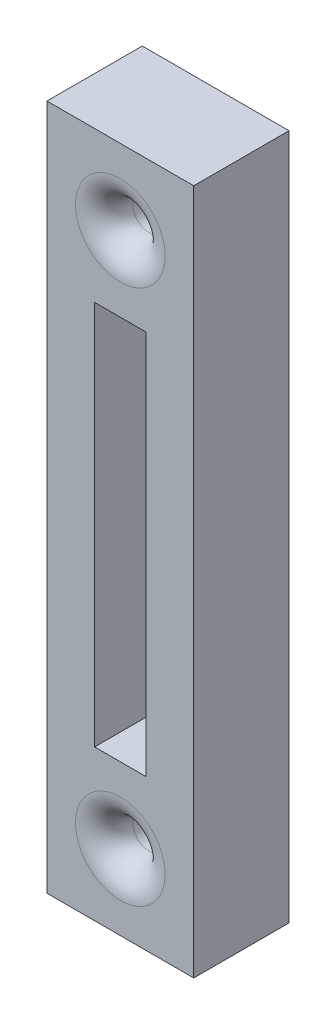
ISO-10303-21;
HEADER;
FILE_DESCRIPTION(('STEP AP214'),'2;1');
FILE_NAME('part.step','',(''),(''),'','','');
FILE_SCHEMA(('AUTOMOTIVE_DESIGN { 1 0 10303 214 1 1 1 1 }'));
ENDSEC;
DATA;
#1=APPLICATION_CONTEXT('core data for automotive mechanical design processes');
#2=APPLICATION_PROTOCOL_DEFINITION('international standard','automotive_design',2000,#1);
#3=PRODUCT_CONTEXT('',#1,'mechanical');
#4=PRODUCT('Part','Part','',(#3));
#5=PRODUCT_RELATED_PRODUCT_CATEGORY('part','',(#4));
#6=PRODUCT_DEFINITION_FORMATION('','',#4);
#7=PRODUCT_DEFINITION_CONTEXT('part definition',#1,'design');
#8=PRODUCT_DEFINITION('design','',#6,#7);
#9=PRODUCT_DEFINITION_SHAPE('','',#8);
#10=(LENGTH_UNIT() NAMED_UNIT(*) SI_UNIT(.MILLI.,.METRE.));
#11=(NAMED_UNIT(*) PLANE_ANGLE_UNIT() SI_UNIT($,.RADIAN.));
#12=(NAMED_UNIT(*) SI_UNIT($,.STERADIAN.) SOLID_ANGLE_UNIT());
#13=UNCERTAINTY_MEASURE_WITH_UNIT(LENGTH_MEASURE(1.E-05),#10,'distance_accuracy_value','');
#14=(GEOMETRIC_REPRESENTATION_CONTEXT(3) GLOBAL_UNCERTAINTY_ASSIGNED_CONTEXT((#13)) GLOBAL_UNIT_ASSIGNED_CONTEXT((#10,
#11,#12)) REPRESENTATION_CONTEXT('',''));
#15=CARTESIAN_POINT('',(0.,0.,0.));
#16=DIRECTION('',(0.,0.,1.));
#17=DIRECTION('',(1.,0.,0.));
#18=AXIS2_PLACEMENT_3D('',#15,#16,#17);
#19=CARTESIAN_POINT('',(0.,0.,10.));
#20=DIRECTION('',(0.,0.,1.));
#21=DIRECTION('',(1.,0.,0.));
#22=AXIS2_PLACEMENT_3D('',#19,#20,#21);
#23=PLANE('',#22);
#24=CARTESIAN_POINT('',(2.7,-7.9,10.));
#25=DIRECTION('',(0.,0.,1.));
#26=DIRECTION('',(1.,0.,0.));
#27=AXIS2_PLACEMENT_3D('',#24,#25,#26);
#28=CIRCLE('',#27,4.7);
#29=CARTESIAN_POINT('',(7.4,-7.9,10.));
#30=VERTEX_POINT('',#29);
#31=EDGE_CURVE('E201',#30,#30,#28,.F.);
#32=ORIENTED_EDGE('',*,*,#31,.T.);
#33=EDGE_LOOP('',(#32));
#34=FACE_BOUND('',#33,.T.);
#35=CARTESIAN_POINT('',(2.7,48.3,10.));
#36=DIRECTION('',(0.,0.,1.));
#37=DIRECTION('',(1.,0.,0.));
#38=AXIS2_PLACEMENT_3D('',#35,#36,#37);
#39=CIRCLE('',#38,4.7);
#40=CARTESIAN_POINT('',(7.4,48.3,10.));
#41=VERTEX_POINT('',#40);
#42=EDGE_CURVE('E198',#41,#41,#39,.F.);
#43=ORIENTED_EDGE('',*,*,#42,.T.);
#44=EDGE_LOOP('',(#43));
#45=FACE_BOUND('',#44,.T.);
#46=DIRECTION('',(0.,-1.,0.));
#47=VECTOR('',#46,1.);
#48=CARTESIAN_POINT('',(-5.,0.,10.));
#49=LINE('',#48,#47);
#50=CARTESIAN_POINT('',(-5.,56.2,10.));
#51=VERTEX_POINT('',#50);
#52=CARTESIAN_POINT('',(-5.,-15.8,10.));
#53=VERTEX_POINT('',#52);
#54=EDGE_CURVE('E187',#51,#53,#49,.T.);
#55=ORIENTED_EDGE('',*,*,#54,.T.);
#56=DIRECTION('',(1.,0.,0.));
#57=VECTOR('',#56,1.);
#58=CARTESIAN_POINT('',(-5.,-15.8,10.));
#59=LINE('',#58,#57);
#60=CARTESIAN_POINT('',(10.4,-15.8,10.));
#61=VERTEX_POINT('',#60);
#62=EDGE_CURVE('E145',#53,#61,#59,.T.);
#63=ORIENTED_EDGE('',*,*,#62,.T.);
#64=DIRECTION('',(0.,1.,0.));
#65=VECTOR('',#64,1.);
#66=CARTESIAN_POINT('',(10.4,0.,10.));
#67=LINE('',#66,#65);
#68=CARTESIAN_POINT('',(10.4,56.2,10.));
#69=VERTEX_POINT('',#68);
#70=EDGE_CURVE('E189',#61,#69,#67,.T.);
#71=ORIENTED_EDGE('',*,*,#70,.T.);
#72=DIRECTION('',(1.,0.,0.));
#73=VECTOR('',#72,1.);
#74=CARTESIAN_POINT('',(-5.,56.2,10.));
#75=LINE('',#74,#73);
#76=EDGE_CURVE('E155',#51,#69,#75,.T.);
#77=ORIENTED_EDGE('',*,*,#76,.F.);
#78=EDGE_LOOP('',(#55,#63,#71,#77));
#79=FACE_BOUND('',#78,.T.);
#80=DIRECTION('',(1.,0.,0.));
#81=VECTOR('',#80,1.);
#82=CARTESIAN_POINT('',(0.,0.,10.));
#83=LINE('',#82,#81);
#84=CARTESIAN_POINT('',(0.,0.,10.));
#85=VERTEX_POINT('',#84);
#86=CARTESIAN_POINT('',(5.4,0.,10.));
#87=VERTEX_POINT('',#86);
#88=EDGE_CURVE('E165',#85,#87,#83,.T.);
#89=ORIENTED_EDGE('',*,*,#88,.F.);
#90=DIRECTION('',(0.,-1.,0.));
#91=VECTOR('',#90,1.);
#92=CARTESIAN_POINT('',(0.,0.,10.));
#93=LINE('',#92,#91);
#94=CARTESIAN_POINT('',(0.,40.4,10.));
#95=VERTEX_POINT('',#94);
#96=EDGE_CURVE('E163',#95,#85,#93,.T.);
#97=ORIENTED_EDGE('',*,*,#96,.F.);
#98=DIRECTION('',(-1.,0.,0.));
#99=VECTOR('',#98,1.);
#100=CARTESIAN_POINT('',(0.,40.4,10.));
#101=LINE('',#100,#99);
#102=CARTESIAN_POINT('',(5.39999999999999,40.4,10.));
#103=VERTEX_POINT('',#102);
#104=EDGE_CURVE('E170',#103,#95,#101,.T.);
#105=ORIENTED_EDGE('',*,*,#104,.F.);
#106=DIRECTION('',(0.,1.,0.));
#107=VECTOR('',#106,1.);
#108=CARTESIAN_POINT('',(5.4,0.,10.));
#109=LINE('',#108,#107);
#110=EDGE_CURVE('E168',#87,#103,#109,.T.);
#111=ORIENTED_EDGE('',*,*,#110,.F.);
#112=EDGE_LOOP('',(#89,#97,#105,#111));
#113=FACE_BOUND('',#112,.T.);
#114=ADVANCED_FACE('F57',(#34,#45,#79,#113),#23,.T.);
#115=CARTESIAN_POINT('',(0.,0.,0.));
#116=DIRECTION('',(0.,0.,1.));
#117=DIRECTION('',(1.,0.,0.));
#118=AXIS2_PLACEMENT_3D('',#115,#116,#117);
#119=PLANE('',#118);
#120=CARTESIAN_POINT('',(2.7,-7.9,0.));
#121=DIRECTION('',(0.,0.,1.));
#122=DIRECTION('',(1.,0.,0.));
#123=AXIS2_PLACEMENT_3D('',#120,#121,#122);
#124=CIRCLE('',#123,4.7);
#125=CARTESIAN_POINT('',(7.4,-7.9,0.));
#126=VERTEX_POINT('',#125);
#127=EDGE_CURVE('E12',#126,#126,#124,.T.);
#128=ORIENTED_EDGE('',*,*,#127,.T.);
#129=EDGE_LOOP('',(#128));
#130=FACE_BOUND('',#129,.T.);
#131=CARTESIAN_POINT('',(2.7,48.3,0.));
#132=DIRECTION('',(0.,0.,1.));
#133=DIRECTION('',(1.,0.,0.));
#134=AXIS2_PLACEMENT_3D('',#131,#132,#133);
#135=CIRCLE('',#134,4.7);
#136=CARTESIAN_POINT('',(7.4,48.3,0.));
#137=VERTEX_POINT('',#136);
#138=EDGE_CURVE('E65',#137,#137,#135,.T.);
#139=ORIENTED_EDGE('',*,*,#138,.T.);
#140=EDGE_LOOP('',(#139));
#141=FACE_BOUND('',#140,.T.);
#142=DIRECTION('',(0.,-1.,0.));
#143=VECTOR('',#142,1.);
#144=CARTESIAN_POINT('',(-5.,0.,0.));
#145=LINE('',#144,#143);
#146=CARTESIAN_POINT('',(-5.,56.2,0.));
#147=VERTEX_POINT('',#146);
#148=CARTESIAN_POINT('',(-5.,-15.8,0.));
#149=VERTEX_POINT('',#148);
#150=EDGE_CURVE('E124',#147,#149,#145,.T.);
#151=ORIENTED_EDGE('',*,*,#150,.F.);
#152=DIRECTION('',(-1.,0.,0.));
#153=VECTOR('',#152,1.);
#154=CARTESIAN_POINT('',(-5.,56.2,0.));
#155=LINE('',#154,#153);
#156=CARTESIAN_POINT('',(10.4,56.2,0.));
#157=VERTEX_POINT('',#156);
#158=EDGE_CURVE('E161',#157,#147,#155,.T.);
#159=ORIENTED_EDGE('',*,*,#158,.F.);
#160=DIRECTION('',(0.,1.,0.));
#161=VECTOR('',#160,1.);
#162=CARTESIAN_POINT('',(10.4,0.,0.));
#163=LINE('',#162,#161);
#164=CARTESIAN_POINT('',(10.4,-15.8,0.));
#165=VERTEX_POINT('',#164);
#166=EDGE_CURVE('E135',#165,#157,#163,.T.);
#167=ORIENTED_EDGE('',*,*,#166,.F.);
#168=DIRECTION('',(-1.,0.,0.));
#169=VECTOR('',#168,1.);
#170=CARTESIAN_POINT('',(-5.,-15.8,0.));
#171=LINE('',#170,#169);
#172=EDGE_CURVE('E142',#165,#149,#171,.T.);
#173=ORIENTED_EDGE('',*,*,#172,.T.);
#174=EDGE_LOOP('',(#151,#159,#167,#173));
#175=FACE_BOUND('',#174,.T.);
#176=DIRECTION('',(0.,-1.,0.));
#177=VECTOR('',#176,1.);
#178=CARTESIAN_POINT('',(0.,0.,0.));
#179=LINE('',#178,#177);
#180=CARTESIAN_POINT('',(0.,40.4,0.));
#181=VERTEX_POINT('',#180);
#182=CARTESIAN_POINT('',(0.,0.,0.));
#183=VERTEX_POINT('',#182);
#184=EDGE_CURVE('E80',#181,#183,#179,.T.);
#185=ORIENTED_EDGE('',*,*,#184,.T.);
#186=DIRECTION('',(1.,0.,0.));
#187=VECTOR('',#186,1.);
#188=CARTESIAN_POINT('',(0.,0.,0.));
#189=LINE('',#188,#187);
#190=CARTESIAN_POINT('',(5.4,0.,0.));
#191=VERTEX_POINT('',#190);
#192=EDGE_CURVE('E174',#183,#191,#189,.T.);
#193=ORIENTED_EDGE('',*,*,#192,.T.);
#194=DIRECTION('',(0.,1.,0.));
#195=VECTOR('',#194,1.);
#196=CARTESIAN_POINT('',(5.4,0.,0.));
#197=LINE('',#196,#195);
#198=CARTESIAN_POINT('',(5.39999999999999,40.4,0.));
#199=VERTEX_POINT('',#198);
#200=EDGE_CURVE('E177',#191,#199,#197,.T.);
#201=ORIENTED_EDGE('',*,*,#200,.T.);
#202=DIRECTION('',(-1.,0.,0.));
#203=VECTOR('',#202,1.);
#204=CARTESIAN_POINT('',(0.,40.4,0.));
#205=LINE('',#204,#203);
#206=EDGE_CURVE('E166',#199,#181,#205,.T.);
#207=ORIENTED_EDGE('',*,*,#206,.T.);
#208=EDGE_LOOP('',(#185,#193,#201,#207));
#209=FACE_BOUND('',#208,.T.);
#210=ADVANCED_FACE('F147',(#130,#141,#175,#209),#119,.F.);
#211=CARTESIAN_POINT('',(-5.,0.,10.));
#212=DIRECTION('',(1.,0.,0.));
#213=DIRECTION('',(0.,1.,0.));
#214=AXIS2_PLACEMENT_3D('',#211,#212,#213);
#215=PLANE('',#214);
#216=ORIENTED_EDGE('',*,*,#150,.T.);
#217=DIRECTION('',(0.,0.,1.));
#218=VECTOR('',#217,1.);
#219=CARTESIAN_POINT('',(-5.,-15.8,10.));
#220=LINE('',#219,#218);
#221=EDGE_CURVE('E127',#149,#53,#220,.T.);
#222=ORIENTED_EDGE('',*,*,#221,.T.);
#223=ORIENTED_EDGE('',*,*,#54,.F.);
#224=DIRECTION('',(0.,0.,1.));
#225=VECTOR('',#224,1.);
#226=CARTESIAN_POINT('',(-5.,56.2,10.));
#227=LINE('',#226,#225);
#228=EDGE_CURVE('E130',#147,#51,#227,.T.);
#229=ORIENTED_EDGE('',*,*,#228,.F.);
#230=EDGE_LOOP('',(#216,#222,#223,#229));
#231=FACE_BOUND('',#230,.T.);
#232=ADVANCED_FACE('F126',(#231),#215,.F.);
#233=CARTESIAN_POINT('',(10.4,0.,10.));
#234=DIRECTION('',(-1.,0.,0.));
#235=DIRECTION('',(0.,-1.,0.));
#236=AXIS2_PLACEMENT_3D('',#233,#234,#235);
#237=PLANE('',#236);
#238=ORIENTED_EDGE('',*,*,#166,.T.);
#239=DIRECTION('',(0.,0.,-1.));
#240=VECTOR('',#239,1.);
#241=CARTESIAN_POINT('',(10.4,56.2,10.));
#242=LINE('',#241,#240);
#243=EDGE_CURVE('E158',#69,#157,#242,.T.);
#244=ORIENTED_EDGE('',*,*,#243,.F.);
#245=ORIENTED_EDGE('',*,*,#70,.F.);
#246=DIRECTION('',(0.,0.,-1.));
#247=VECTOR('',#246,1.);
#248=CARTESIAN_POINT('',(10.4,-15.8,10.));
#249=LINE('',#248,#247);
#250=EDGE_CURVE('E149',#61,#165,#249,.T.);
#251=ORIENTED_EDGE('',*,*,#250,.T.);
#252=EDGE_LOOP('',(#238,#244,#245,#251));
#253=FACE_BOUND('',#252,.T.);
#254=ADVANCED_FACE('F245',(#253),#237,.F.);
#255=CARTESIAN_POINT('',(0.,0.,10.));
#256=DIRECTION('',(1.,0.,0.));
#257=DIRECTION('',(0.,1.,0.));
#258=AXIS2_PLACEMENT_3D('',#255,#256,#257);
#259=PLANE('',#258);
#260=ORIENTED_EDGE('',*,*,#184,.F.);
#261=DIRECTION('',(0.,0.,-1.));
#262=VECTOR('',#261,1.);
#263=CARTESIAN_POINT('',(0.,40.4,10.));
#264=LINE('',#263,#262);
#265=EDGE_CURVE('E172',#95,#181,#264,.T.);
#266=ORIENTED_EDGE('',*,*,#265,.F.);
#267=ORIENTED_EDGE('',*,*,#96,.T.);
#268=DIRECTION('',(0.,0.,-1.));
#269=VECTOR('',#268,1.);
#270=CARTESIAN_POINT('',(0.,0.,10.));
#271=LINE('',#270,#269);
#272=EDGE_CURVE('E136',#85,#183,#271,.T.);
#273=ORIENTED_EDGE('',*,*,#272,.T.);
#274=EDGE_LOOP('',(#260,#266,#267,#273));
#275=FACE_BOUND('',#274,.T.);
#276=ADVANCED_FACE('F242',(#275),#259,.T.);
#277=CARTESIAN_POINT('',(0.,0.,10.));
#278=DIRECTION('',(0.,1.,0.));
#279=DIRECTION('',(0.,0.,1.));
#280=AXIS2_PLACEMENT_3D('',#277,#278,#279);
#281=PLANE('',#280);
#282=ORIENTED_EDGE('',*,*,#192,.F.);
#283=ORIENTED_EDGE('',*,*,#272,.F.);
#284=ORIENTED_EDGE('',*,*,#88,.T.);
#285=DIRECTION('',(0.,0.,-1.));
#286=VECTOR('',#285,1.);
#287=CARTESIAN_POINT('',(5.4,0.,10.));
#288=LINE('',#287,#286);
#289=EDGE_CURVE('E184',#87,#191,#288,.T.);
#290=ORIENTED_EDGE('',*,*,#289,.T.);
#291=EDGE_LOOP('',(#282,#283,#284,#290));
#292=FACE_BOUND('',#291,.T.);
#293=ADVANCED_FACE('F359',(#292),#281,.T.);
#294=CARTESIAN_POINT('',(5.4,0.,10.));
#295=DIRECTION('',(-1.,0.,0.));
#296=DIRECTION('',(0.,-1.,0.));
#297=AXIS2_PLACEMENT_3D('',#294,#295,#296);
#298=PLANE('',#297);
#299=ORIENTED_EDGE('',*,*,#200,.F.);
#300=ORIENTED_EDGE('',*,*,#289,.F.);
#301=ORIENTED_EDGE('',*,*,#110,.T.);
#302=DIRECTION('',(0.,0.,-1.));
#303=VECTOR('',#302,1.);
#304=CARTESIAN_POINT('',(5.39999999999999,40.4,10.));
#305=LINE('',#304,#303);
#306=EDGE_CURVE('E72',#103,#199,#305,.T.);
#307=ORIENTED_EDGE('',*,*,#306,.T.);
#308=EDGE_LOOP('',(#299,#300,#301,#307));
#309=FACE_BOUND('',#308,.T.);
#310=ADVANCED_FACE('F350',(#309),#298,.T.);
#311=CARTESIAN_POINT('',(0.,40.4,10.));
#312=DIRECTION('',(0.,-1.,0.));
#313=DIRECTION('',(0.,0.,-1.));
#314=AXIS2_PLACEMENT_3D('',#311,#312,#313);
#315=PLANE('',#314);
#316=ORIENTED_EDGE('',*,*,#206,.F.);
#317=ORIENTED_EDGE('',*,*,#306,.F.);
#318=ORIENTED_EDGE('',*,*,#104,.T.);
#319=ORIENTED_EDGE('',*,*,#265,.T.);
#320=EDGE_LOOP('',(#316,#317,#318,#319));
#321=FACE_BOUND('',#320,.T.);
#322=ADVANCED_FACE('F341',(#321),#315,.T.);
#323=CARTESIAN_POINT('',(0.,56.2,0.));
#324=DIRECTION('',(0.,-1.,0.));
#325=DIRECTION('',(0.,0.,-1.));
#326=AXIS2_PLACEMENT_3D('',#323,#324,#325);
#327=PLANE('',#326);
#328=ORIENTED_EDGE('',*,*,#228,.T.);
#329=ORIENTED_EDGE('',*,*,#76,.T.);
#330=ORIENTED_EDGE('',*,*,#243,.T.);
#331=ORIENTED_EDGE('',*,*,#158,.T.);
#332=EDGE_LOOP('',(#328,#329,#330,#331));
#333=FACE_BOUND('',#332,.T.);
#334=ADVANCED_FACE('F230',(#333),#327,.F.);
#335=CARTESIAN_POINT('',(0.,-15.8,0.));
#336=DIRECTION('',(0.,1.,0.));
#337=DIRECTION('',(0.,0.,-1.));
#338=AXIS2_PLACEMENT_3D('',#335,#336,#337);
#339=PLANE('',#338);
#340=ORIENTED_EDGE('',*,*,#221,.F.);
#341=ORIENTED_EDGE('',*,*,#172,.F.);
#342=ORIENTED_EDGE('',*,*,#250,.F.);
#343=ORIENTED_EDGE('',*,*,#62,.F.);
#344=EDGE_LOOP('',(#340,#341,#342,#343));
#345=FACE_BOUND('',#344,.T.);
#346=ADVANCED_FACE('F140',(#345),#339,.F.);
#347=CARTESIAN_POINT('',(2.7,48.3,10.));
#348=DIRECTION('',(0.,0.,-1.));
#349=DIRECTION('',(-1.,0.,0.));
#350=AXIS2_PLACEMENT_3D('',#347,#348,#349);
#351=CYLINDRICAL_SURFACE('',#350,1.7);
#352=CARTESIAN_POINT('',(2.7,48.3,7.));
#353=DIRECTION('',(0.,0.,1.));
#354=DIRECTION('',(1.,0.,0.));
#355=AXIS2_PLACEMENT_3D('',#352,#353,#354);
#356=CIRCLE('',#355,1.7);
#357=CARTESIAN_POINT('',(4.4,48.3,7.));
#358=VERTEX_POINT('',#357);
#359=EDGE_CURVE('E207',#358,#358,#356,.T.);
#360=ORIENTED_EDGE('',*,*,#359,.T.);
#361=EDGE_LOOP('',(#360));
#362=FACE_BOUND('',#361,.T.);
#363=CARTESIAN_POINT('',(2.7,48.3,3.));
#364=DIRECTION('',(0.,0.,1.));
#365=DIRECTION('',(1.,0.,0.));
#366=AXIS2_PLACEMENT_3D('',#363,#364,#365);
#367=CIRCLE('',#366,1.7);
#368=CARTESIAN_POINT('',(4.4,48.3,3.));
#369=VERTEX_POINT('',#368);
#370=EDGE_CURVE('E204',#369,#369,#367,.F.);
#371=ORIENTED_EDGE('',*,*,#370,.T.);
#372=EDGE_LOOP('',(#371));
#373=FACE_BOUND('',#372,.T.);
#374=ADVANCED_FACE('F218',(#362,#373),#351,.F.);
#375=CARTESIAN_POINT('',(2.7,-7.9,10.));
#376=DIRECTION('',(0.,0.,-1.));
#377=DIRECTION('',(-1.,0.,0.));
#378=AXIS2_PLACEMENT_3D('',#375,#376,#377);
#379=CYLINDRICAL_SURFACE('',#378,1.7);
#380=CARTESIAN_POINT('',(2.7,-7.9,7.));
#381=DIRECTION('',(0.,0.,1.));
#382=DIRECTION('',(1.,0.,0.));
#383=AXIS2_PLACEMENT_3D('',#380,#381,#382);
#384=CIRCLE('',#383,1.7);
#385=CARTESIAN_POINT('',(4.4,-7.9,7.));
#386=VERTEX_POINT('',#385);
#387=EDGE_CURVE('E195',#386,#386,#384,.T.);
#388=ORIENTED_EDGE('',*,*,#387,.T.);
#389=EDGE_LOOP('',(#388));
#390=FACE_BOUND('',#389,.T.);
#391=CARTESIAN_POINT('',(2.7,-7.9,3.));
#392=DIRECTION('',(0.,0.,1.));
#393=DIRECTION('',(1.,0.,0.));
#394=AXIS2_PLACEMENT_3D('',#391,#392,#393);
#395=CIRCLE('',#394,1.7);
#396=CARTESIAN_POINT('',(4.4,-7.9,3.));
#397=VERTEX_POINT('',#396);
#398=EDGE_CURVE('E190',#397,#397,#395,.F.);
#399=ORIENTED_EDGE('',*,*,#398,.T.);
#400=EDGE_LOOP('',(#399));
#401=FACE_BOUND('',#400,.T.);
#402=ADVANCED_FACE('F220',(#390,#401),#379,.F.);
#403=CARTESIAN_POINT('',(2.7,-7.9,7.));
#404=DIRECTION('',(0.,0.,1.));
#405=DIRECTION('',(1.,0.,0.));
#406=AXIS2_PLACEMENT_3D('',#403,#404,#405);
#407=TOROIDAL_SURFACE('',#406,4.7,3.);
#408=ORIENTED_EDGE('',*,*,#31,.F.);
#409=EDGE_LOOP('',(#408));
#410=FACE_BOUND('',#409,.T.);
#411=ORIENTED_EDGE('',*,*,#387,.F.);
#412=EDGE_LOOP('',(#411));
#413=FACE_BOUND('',#412,.T.);
#414=ADVANCED_FACE('F227',(#410,#413),#407,.T.);
#415=CARTESIAN_POINT('',(2.7,48.3,7.));
#416=DIRECTION('',(0.,0.,1.));
#417=DIRECTION('',(1.,0.,0.));
#418=AXIS2_PLACEMENT_3D('',#415,#416,#417);
#419=TOROIDAL_SURFACE('',#418,4.7,3.);
#420=ORIENTED_EDGE('',*,*,#359,.F.);
#421=EDGE_LOOP('',(#420));
#422=FACE_BOUND('',#421,.T.);
#423=ORIENTED_EDGE('',*,*,#42,.F.);
#424=EDGE_LOOP('',(#423));
#425=FACE_BOUND('',#424,.T.);
#426=ADVANCED_FACE('F253',(#422,#425),#419,.T.);
#427=CARTESIAN_POINT('',(2.7,-7.9,3.));
#428=DIRECTION('',(0.,0.,1.));
#429=DIRECTION('',(1.,0.,0.));
#430=AXIS2_PLACEMENT_3D('',#427,#428,#429);
#431=TOROIDAL_SURFACE('',#430,4.7,3.);
#432=ORIENTED_EDGE('',*,*,#398,.F.);
#433=EDGE_LOOP('',(#432));
#434=FACE_BOUND('',#433,.T.);
#435=ORIENTED_EDGE('',*,*,#127,.F.);
#436=EDGE_LOOP('',(#435));
#437=FACE_BOUND('',#436,.T.);
#438=ADVANCED_FACE('F215',(#434,#437),#431,.T.);
#439=CARTESIAN_POINT('',(2.7,48.3,3.));
#440=DIRECTION('',(0.,0.,1.));
#441=DIRECTION('',(1.,0.,0.));
#442=AXIS2_PLACEMENT_3D('',#439,#440,#441);
#443=TOROIDAL_SURFACE('',#442,4.7,3.);
#444=ORIENTED_EDGE('',*,*,#138,.F.);
#445=EDGE_LOOP('',(#444));
#446=FACE_BOUND('',#445,.T.);
#447=ORIENTED_EDGE('',*,*,#370,.F.);
#448=EDGE_LOOP('',(#447));
#449=FACE_BOUND('',#448,.T.);
#450=ADVANCED_FACE('F59',(#446,#449),#443,.T.);
#451=CLOSED_SHELL('',(#114,#210,#232,#254,#276,#293,#310,#322,#334,#346,#374,#402,#414,#426,
#438,#450));
#452=MANIFOLD_SOLID_BREP('B2',#451);
#453=ADVANCED_BREP_SHAPE_REPRESENTATION('',(#18,#452),#14);
#454=SHAPE_DEFINITION_REPRESENTATION(#9,#453);
ENDSEC;
END-ISO-10303-21;
